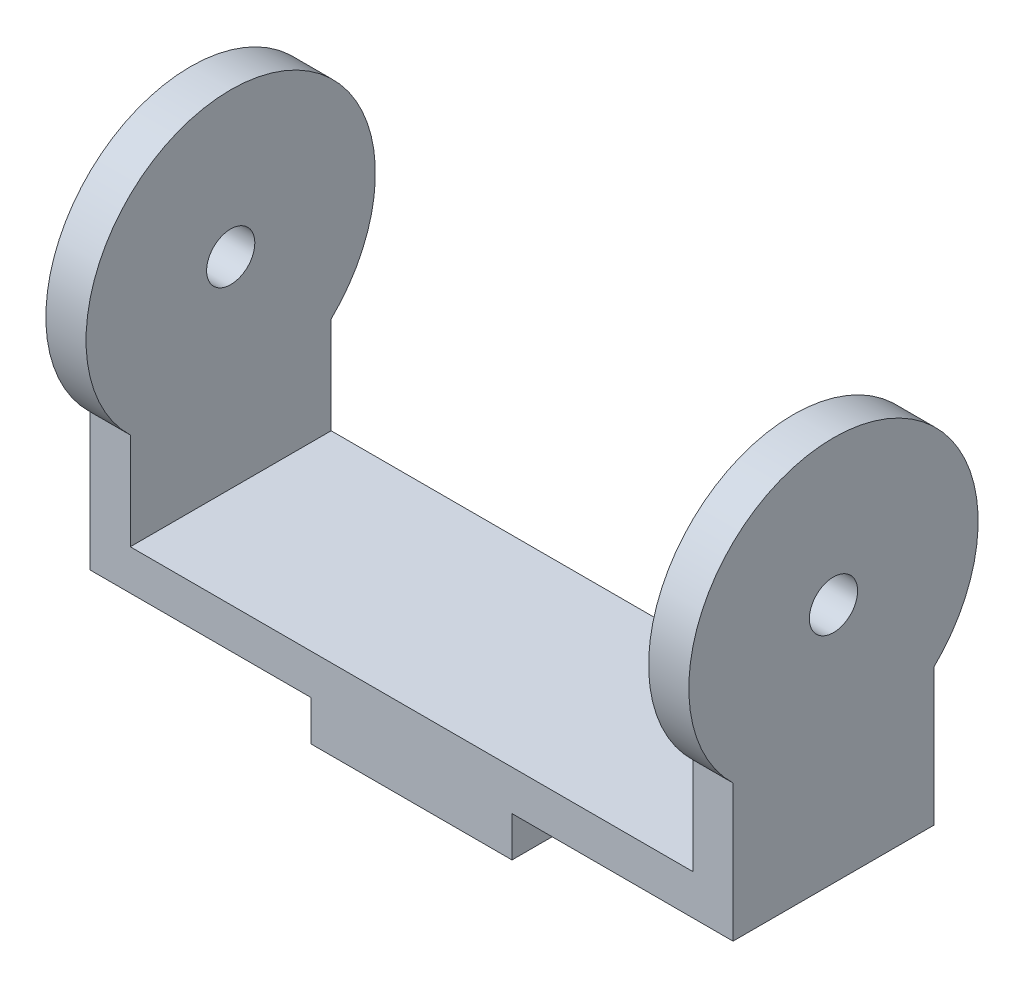
ISO-10303-21;
HEADER;
FILE_DESCRIPTION(('STEP AP214'),'2;1');
FILE_NAME('part.step','',(''),(''),'','','');
FILE_SCHEMA(('AUTOMOTIVE_DESIGN { 1 0 10303 214 1 1 1 1 }'));
ENDSEC;
DATA;
#1=APPLICATION_CONTEXT('core data for automotive mechanical design processes');
#2=APPLICATION_PROTOCOL_DEFINITION('international standard','automotive_design',2000,#1);
#3=PRODUCT_CONTEXT('',#1,'mechanical');
#4=PRODUCT('Part','Part','',(#3));
#5=PRODUCT_RELATED_PRODUCT_CATEGORY('part','',(#4));
#6=PRODUCT_DEFINITION_FORMATION('','',#4);
#7=PRODUCT_DEFINITION_CONTEXT('part definition',#1,'design');
#8=PRODUCT_DEFINITION('design','',#6,#7);
#9=PRODUCT_DEFINITION_SHAPE('','',#8);
#10=(LENGTH_UNIT() NAMED_UNIT(*) SI_UNIT(.MILLI.,.METRE.));
#11=(NAMED_UNIT(*) PLANE_ANGLE_UNIT() SI_UNIT($,.RADIAN.));
#12=(NAMED_UNIT(*) SI_UNIT($,.STERADIAN.) SOLID_ANGLE_UNIT());
#13=UNCERTAINTY_MEASURE_WITH_UNIT(LENGTH_MEASURE(1.E-05),#10,'distance_accuracy_value','');
#14=(GEOMETRIC_REPRESENTATION_CONTEXT(3) GLOBAL_UNCERTAINTY_ASSIGNED_CONTEXT((#13)) GLOBAL_UNIT_ASSIGNED_CONTEXT((#10,
#11,#12)) REPRESENTATION_CONTEXT('',''));
#15=CARTESIAN_POINT('',(0.,0.,0.));
#16=DIRECTION('',(0.,0.,1.));
#17=DIRECTION('',(1.,0.,0.));
#18=AXIS2_PLACEMENT_3D('',#15,#16,#17);
#19=CARTESIAN_POINT('',(0.,0.,0.));
#20=DIRECTION('',(0.,1.,0.));
#21=DIRECTION('',(0.,0.,1.));
#22=AXIS2_PLACEMENT_3D('',#19,#20,#21);
#23=PLANE('',#22);
#24=DIRECTION('',(0.,0.,1.));
#25=VECTOR('',#24,1.);
#26=CARTESIAN_POINT('',(12.5,0.,12.5));
#27=LINE('',#26,#25);
#28=CARTESIAN_POINT('',(12.5,0.,-12.5));
#29=VERTEX_POINT('',#28);
#30=CARTESIAN_POINT('',(12.5,0.,12.5));
#31=VERTEX_POINT('',#30);
#32=EDGE_CURVE('E52',#29,#31,#27,.T.);
#33=ORIENTED_EDGE('',*,*,#32,.F.);
#34=DIRECTION('',(-1.,0.,0.));
#35=VECTOR('',#34,1.);
#36=CARTESIAN_POINT('',(0.,0.,-12.5));
#37=LINE('',#36,#35);
#38=CARTESIAN_POINT('',(40.,0.,-12.5));
#39=VERTEX_POINT('',#38);
#40=EDGE_CURVE('E223',#39,#29,#37,.T.);
#41=ORIENTED_EDGE('',*,*,#40,.F.);
#42=DIRECTION('',(0.,0.,-1.));
#43=VECTOR('',#42,1.);
#44=CARTESIAN_POINT('',(40.,0.,-12.5));
#45=LINE('',#44,#43);
#46=CARTESIAN_POINT('',(40.,0.,12.5));
#47=VERTEX_POINT('',#46);
#48=EDGE_CURVE('E211',#47,#39,#45,.T.);
#49=ORIENTED_EDGE('',*,*,#48,.F.);
#50=DIRECTION('',(1.,0.,0.));
#51=VECTOR('',#50,1.);
#52=CARTESIAN_POINT('',(0.,0.,12.5));
#53=LINE('',#52,#51);
#54=EDGE_CURVE('E57',#31,#47,#53,.T.);
#55=ORIENTED_EDGE('',*,*,#54,.F.);
#56=EDGE_LOOP('',(#33,#41,#49,#55));
#57=FACE_BOUND('',#56,.T.);
#58=ADVANCED_FACE('F37',(#57),#23,.F.);
#59=DIRECTION('',(0.,0.,-1.));
#60=VECTOR('',#59,1.);
#61=CARTESIAN_POINT('',(-12.5,0.,12.5));
#62=LINE('',#61,#60);
#63=CARTESIAN_POINT('',(-12.5,0.,12.5));
#64=VERTEX_POINT('',#63);
#65=CARTESIAN_POINT('',(-12.5,0.,-12.5));
#66=VERTEX_POINT('',#65);
#67=EDGE_CURVE('E144',#64,#66,#62,.T.);
#68=ORIENTED_EDGE('',*,*,#67,.F.);
#69=CARTESIAN_POINT('',(-40.,0.,12.5));
#70=VERTEX_POINT('',#69);
#71=EDGE_CURVE('E218',#70,#64,#53,.T.);
#72=ORIENTED_EDGE('',*,*,#71,.F.);
#73=DIRECTION('',(0.,0.,-1.));
#74=VECTOR('',#73,1.);
#75=CARTESIAN_POINT('',(-40.,0.,-12.5));
#76=LINE('',#75,#74);
#77=CARTESIAN_POINT('',(-40.,0.,-12.5));
#78=VERTEX_POINT('',#77);
#79=EDGE_CURVE('E175',#70,#78,#76,.T.);
#80=ORIENTED_EDGE('',*,*,#79,.T.);
#81=EDGE_CURVE('E222',#66,#78,#37,.T.);
#82=ORIENTED_EDGE('',*,*,#81,.F.);
#83=EDGE_LOOP('',(#68,#72,#80,#82));
#84=FACE_BOUND('',#83,.T.);
#85=ADVANCED_FACE('F267',(#84),#23,.F.);
#86=CARTESIAN_POINT('',(0.,5.,0.));
#87=DIRECTION('',(0.,1.,0.));
#88=DIRECTION('',(0.,0.,1.));
#89=AXIS2_PLACEMENT_3D('',#86,#87,#88);
#90=PLANE('',#89);
#91=DIRECTION('',(-1.,0.,0.));
#92=VECTOR('',#91,1.);
#93=CARTESIAN_POINT('',(0.,5.,-12.5));
#94=LINE('',#93,#92);
#95=CARTESIAN_POINT('',(35.,5.,-12.5));
#96=VERTEX_POINT('',#95);
#97=CARTESIAN_POINT('',(-35.,5.,-12.5));
#98=VERTEX_POINT('',#97);
#99=EDGE_CURVE('E214',#96,#98,#94,.T.);
#100=ORIENTED_EDGE('',*,*,#99,.T.);
#101=DIRECTION('',(0.,0.,1.));
#102=VECTOR('',#101,1.);
#103=CARTESIAN_POINT('',(-35.,5.,0.));
#104=LINE('',#103,#102);
#105=CARTESIAN_POINT('',(-35.,5.,12.5));
#106=VERTEX_POINT('',#105);
#107=EDGE_CURVE('E164',#98,#106,#104,.T.);
#108=ORIENTED_EDGE('',*,*,#107,.T.);
#109=DIRECTION('',(1.,0.,0.));
#110=VECTOR('',#109,1.);
#111=CARTESIAN_POINT('',(0.,5.,12.5));
#112=LINE('',#111,#110);
#113=CARTESIAN_POINT('',(35.,5.,12.5));
#114=VERTEX_POINT('',#113);
#115=EDGE_CURVE('E217',#106,#114,#112,.T.);
#116=ORIENTED_EDGE('',*,*,#115,.T.);
#117=DIRECTION('',(0.,0.,1.));
#118=VECTOR('',#117,1.);
#119=CARTESIAN_POINT('',(35.,5.,0.));
#120=LINE('',#119,#118);
#121=EDGE_CURVE('E197',#96,#114,#120,.T.);
#122=ORIENTED_EDGE('',*,*,#121,.F.);
#123=EDGE_LOOP('',(#100,#108,#116,#122));
#124=FACE_BOUND('',#123,.T.);
#125=ADVANCED_FACE('F241',(#124),#90,.T.);
#126=CARTESIAN_POINT('',(40.,5.,-12.5));
#127=DIRECTION('',(-1.,0.,0.));
#128=DIRECTION('',(0.,0.,1.));
#129=AXIS2_PLACEMENT_3D('',#126,#127,#128);
#130=PLANE('',#129);
#131=ORIENTED_EDGE('',*,*,#48,.T.);
#132=DIRECTION('',(0.,-1.,0.));
#133=VECTOR('',#132,1.);
#134=CARTESIAN_POINT('',(40.,5.,-12.5));
#135=LINE('',#134,#133);
#136=CARTESIAN_POINT('',(40.,17.0481661530114,-12.5));
#137=VERTEX_POINT('',#136);
#138=EDGE_CURVE('E11',#137,#39,#135,.T.);
#139=ORIENTED_EDGE('',*,*,#138,.F.);
#140=CARTESIAN_POINT('',(40.,30.,0.));
#141=DIRECTION('',(1.,0.,0.));
#142=DIRECTION('',(0.,0.,-1.));
#143=AXIS2_PLACEMENT_3D('',#140,#141,#142);
#144=CIRCLE('',#143,18.);
#145=CARTESIAN_POINT('',(40.,17.0481661530114,12.5));
#146=VERTEX_POINT('',#145);
#147=EDGE_CURVE('E191',#137,#146,#144,.T.);
#148=ORIENTED_EDGE('',*,*,#147,.T.);
#149=DIRECTION('',(0.,-1.,0.));
#150=VECTOR('',#149,1.);
#151=CARTESIAN_POINT('',(40.,5.,12.5));
#152=LINE('',#151,#150);
#153=EDGE_CURVE('E45',#146,#47,#152,.T.);
#154=ORIENTED_EDGE('',*,*,#153,.T.);
#155=EDGE_LOOP('',(#131,#139,#148,#154));
#156=FACE_BOUND('',#155,.T.);
#157=CARTESIAN_POINT('',(40.,30.,0.));
#158=DIRECTION('',(1.,0.,0.));
#159=DIRECTION('',(0.,0.,-1.));
#160=AXIS2_PLACEMENT_3D('',#157,#158,#159);
#161=CIRCLE('',#160,3.);
#162=CARTESIAN_POINT('',(40.,30.,-3.));
#163=VERTEX_POINT('',#162);
#164=EDGE_CURVE('E186',#163,#163,#161,.T.);
#165=ORIENTED_EDGE('',*,*,#164,.F.);
#166=EDGE_LOOP('',(#165));
#167=FACE_BOUND('',#166,.T.);
#168=ADVANCED_FACE('F39',(#156,#167),#130,.F.);
#169=CARTESIAN_POINT('',(0.,5.,-12.5));
#170=DIRECTION('',(0.,0.,1.));
#171=DIRECTION('',(1.,0.,0.));
#172=AXIS2_PLACEMENT_3D('',#169,#170,#171);
#173=PLANE('',#172);
#174=ORIENTED_EDGE('',*,*,#40,.T.);
#175=DIRECTION('',(0.,1.,0.));
#176=VECTOR('',#175,1.);
#177=CARTESIAN_POINT('',(12.5,-5.,-12.5));
#178=LINE('',#177,#176);
#179=CARTESIAN_POINT('',(12.5,-5.,-12.5));
#180=VERTEX_POINT('',#179);
#181=EDGE_CURVE('E262',#180,#29,#178,.T.);
#182=ORIENTED_EDGE('',*,*,#181,.F.);
#183=DIRECTION('',(1.,0.,0.));
#184=VECTOR('',#183,1.);
#185=CARTESIAN_POINT('',(-12.5,-5.,-12.5));
#186=LINE('',#185,#184);
#187=CARTESIAN_POINT('',(-12.5,-5.,-12.5));
#188=VERTEX_POINT('',#187);
#189=EDGE_CURVE('E140',#188,#180,#186,.T.);
#190=ORIENTED_EDGE('',*,*,#189,.F.);
#191=DIRECTION('',(0.,1.,0.));
#192=VECTOR('',#191,1.);
#193=CARTESIAN_POINT('',(-12.5,-5.,-12.5));
#194=LINE('',#193,#192);
#195=EDGE_CURVE('E152',#188,#66,#194,.T.);
#196=ORIENTED_EDGE('',*,*,#195,.T.);
#197=ORIENTED_EDGE('',*,*,#81,.T.);
#198=DIRECTION('',(0.,-1.,0.));
#199=VECTOR('',#198,1.);
#200=CARTESIAN_POINT('',(-40.,5.,-12.5));
#201=LINE('',#200,#199);
#202=CARTESIAN_POINT('',(-40.,17.0481661530114,-12.5));
#203=VERTEX_POINT('',#202);
#204=EDGE_CURVE('E180',#203,#78,#201,.T.);
#205=ORIENTED_EDGE('',*,*,#204,.F.);
#206=DIRECTION('',(-1.,0.,0.));
#207=VECTOR('',#206,1.);
#208=CARTESIAN_POINT('',(-35.,17.0481661530114,-12.5));
#209=LINE('',#208,#207);
#210=CARTESIAN_POINT('',(-35.,17.0481661530114,-12.5));
#211=VERTEX_POINT('',#210);
#212=EDGE_CURVE('E168',#211,#203,#209,.T.);
#213=ORIENTED_EDGE('',*,*,#212,.F.);
#214=DIRECTION('',(0.,1.,0.));
#215=VECTOR('',#214,1.);
#216=CARTESIAN_POINT('',(-35.,0.,-12.5));
#217=LINE('',#216,#215);
#218=EDGE_CURVE('E162',#98,#211,#217,.T.);
#219=ORIENTED_EDGE('',*,*,#218,.F.);
#220=ORIENTED_EDGE('',*,*,#99,.F.);
#221=DIRECTION('',(0.,1.,0.));
#222=VECTOR('',#221,1.);
#223=CARTESIAN_POINT('',(35.,0.,-12.5));
#224=LINE('',#223,#222);
#225=CARTESIAN_POINT('',(35.,17.0481661530114,-12.5));
#226=VERTEX_POINT('',#225);
#227=EDGE_CURVE('E200',#96,#226,#224,.T.);
#228=ORIENTED_EDGE('',*,*,#227,.T.);
#229=DIRECTION('',(1.,0.,0.));
#230=VECTOR('',#229,1.);
#231=CARTESIAN_POINT('',(35.,17.0481661530114,-12.5));
#232=LINE('',#231,#230);
#233=EDGE_CURVE('E208',#226,#137,#232,.T.);
#234=ORIENTED_EDGE('',*,*,#233,.T.);
#235=ORIENTED_EDGE('',*,*,#138,.T.);
#236=EDGE_LOOP('',(#174,#182,#190,#196,#197,#205,#213,#219,#220,#228,#234,#235));
#237=FACE_BOUND('',#236,.T.);
#238=ADVANCED_FACE('F230',(#237),#173,.F.);
#239=CARTESIAN_POINT('',(0.,5.,12.5));
#240=DIRECTION('',(0.,0.,-1.));
#241=DIRECTION('',(-1.,0.,0.));
#242=AXIS2_PLACEMENT_3D('',#239,#240,#241);
#243=PLANE('',#242);
#244=ORIENTED_EDGE('',*,*,#71,.T.);
#245=DIRECTION('',(0.,1.,0.));
#246=VECTOR('',#245,1.);
#247=CARTESIAN_POINT('',(-12.5,-5.,12.5));
#248=LINE('',#247,#246);
#249=CARTESIAN_POINT('',(-12.5,-5.,12.5));
#250=VERTEX_POINT('',#249);
#251=EDGE_CURVE('E131',#250,#64,#248,.T.);
#252=ORIENTED_EDGE('',*,*,#251,.F.);
#253=DIRECTION('',(-1.,0.,0.));
#254=VECTOR('',#253,1.);
#255=CARTESIAN_POINT('',(-12.5,-5.,12.5));
#256=LINE('',#255,#254);
#257=CARTESIAN_POINT('',(12.5,-5.,12.5));
#258=VERTEX_POINT('',#257);
#259=EDGE_CURVE('E124',#258,#250,#256,.T.);
#260=ORIENTED_EDGE('',*,*,#259,.F.);
#261=DIRECTION('',(0.,1.,0.));
#262=VECTOR('',#261,1.);
#263=CARTESIAN_POINT('',(12.5,-5.,12.5));
#264=LINE('',#263,#262);
#265=EDGE_CURVE('E129',#258,#31,#264,.T.);
#266=ORIENTED_EDGE('',*,*,#265,.T.);
#267=ORIENTED_EDGE('',*,*,#54,.T.);
#268=ORIENTED_EDGE('',*,*,#153,.F.);
#269=DIRECTION('',(1.,0.,0.));
#270=VECTOR('',#269,1.);
#271=CARTESIAN_POINT('',(35.,17.0481661530114,12.5));
#272=LINE('',#271,#270);
#273=CARTESIAN_POINT('',(35.,17.0481661530114,12.5));
#274=VERTEX_POINT('',#273);
#275=EDGE_CURVE('E203',#274,#146,#272,.T.);
#276=ORIENTED_EDGE('',*,*,#275,.F.);
#277=DIRECTION('',(0.,-1.,0.));
#278=VECTOR('',#277,1.);
#279=CARTESIAN_POINT('',(35.,0.,12.5));
#280=LINE('',#279,#278);
#281=EDGE_CURVE('E194',#274,#114,#280,.T.);
#282=ORIENTED_EDGE('',*,*,#281,.T.);
#283=ORIENTED_EDGE('',*,*,#115,.F.);
#284=DIRECTION('',(0.,-1.,0.));
#285=VECTOR('',#284,1.);
#286=CARTESIAN_POINT('',(-35.,0.,12.5));
#287=LINE('',#286,#285);
#288=CARTESIAN_POINT('',(-35.,17.0481661530114,12.5));
#289=VERTEX_POINT('',#288);
#290=EDGE_CURVE('E167',#289,#106,#287,.T.);
#291=ORIENTED_EDGE('',*,*,#290,.F.);
#292=DIRECTION('',(-1.,0.,0.));
#293=VECTOR('',#292,1.);
#294=CARTESIAN_POINT('',(-35.,17.0481661530114,12.5));
#295=LINE('',#294,#293);
#296=CARTESIAN_POINT('',(-40.,17.0481661530114,12.5));
#297=VERTEX_POINT('',#296);
#298=EDGE_CURVE('E172',#289,#297,#295,.T.);
#299=ORIENTED_EDGE('',*,*,#298,.T.);
#300=DIRECTION('',(0.,-1.,0.));
#301=VECTOR('',#300,1.);
#302=CARTESIAN_POINT('',(-40.,5.,12.5));
#303=LINE('',#302,#301);
#304=EDGE_CURVE('E183',#297,#70,#303,.T.);
#305=ORIENTED_EDGE('',*,*,#304,.T.);
#306=EDGE_LOOP('',(#244,#252,#260,#266,#267,#268,#276,#282,#283,#291,#299,#305));
#307=FACE_BOUND('',#306,.T.);
#308=ADVANCED_FACE('F127',(#307),#243,.F.);
#309=CARTESIAN_POINT('',(35.,30.,0.));
#310=DIRECTION('',(1.,0.,0.));
#311=DIRECTION('',(0.,0.,-1.));
#312=AXIS2_PLACEMENT_3D('',#309,#310,#311);
#313=CYLINDRICAL_SURFACE('',#312,18.);
#314=ORIENTED_EDGE('',*,*,#147,.F.);
#315=ORIENTED_EDGE('',*,*,#233,.F.);
#316=CARTESIAN_POINT('',(35.,30.,0.));
#317=DIRECTION('',(1.,0.,0.));
#318=DIRECTION('',(0.,0.,-1.));
#319=AXIS2_PLACEMENT_3D('',#316,#317,#318);
#320=CIRCLE('',#319,18.);
#321=EDGE_CURVE('E190',#226,#274,#320,.T.);
#322=ORIENTED_EDGE('',*,*,#321,.T.);
#323=ORIENTED_EDGE('',*,*,#275,.T.);
#324=EDGE_LOOP('',(#314,#315,#322,#323));
#325=FACE_BOUND('',#324,.T.);
#326=ADVANCED_FACE('F235',(#325),#313,.T.);
#327=CARTESIAN_POINT('',(35.,30.,0.));
#328=DIRECTION('',(1.,0.,0.));
#329=DIRECTION('',(0.,0.,-1.));
#330=AXIS2_PLACEMENT_3D('',#327,#328,#329);
#331=CYLINDRICAL_SURFACE('',#330,3.);
#332=CARTESIAN_POINT('',(35.,30.,0.));
#333=DIRECTION('',(1.,0.,0.));
#334=DIRECTION('',(0.,0.,-1.));
#335=AXIS2_PLACEMENT_3D('',#332,#333,#334);
#336=CIRCLE('',#335,3.);
#337=CARTESIAN_POINT('',(35.,30.,-3.));
#338=VERTEX_POINT('',#337);
#339=EDGE_CURVE('E187',#338,#338,#336,.T.);
#340=ORIENTED_EDGE('',*,*,#339,.F.);
#341=EDGE_LOOP('',(#340));
#342=FACE_BOUND('',#341,.T.);
#343=ORIENTED_EDGE('',*,*,#164,.T.);
#344=EDGE_LOOP('',(#343));
#345=FACE_BOUND('',#344,.T.);
#346=ADVANCED_FACE('F388',(#342,#345),#331,.F.);
#347=CARTESIAN_POINT('',(35.,0.,0.));
#348=DIRECTION('',(1.,0.,0.));
#349=DIRECTION('',(0.,0.,-1.));
#350=AXIS2_PLACEMENT_3D('',#347,#348,#349);
#351=PLANE('',#350);
#352=ORIENTED_EDGE('',*,*,#339,.T.);
#353=EDGE_LOOP('',(#352));
#354=FACE_BOUND('',#353,.T.);
#355=ORIENTED_EDGE('',*,*,#321,.F.);
#356=ORIENTED_EDGE('',*,*,#227,.F.);
#357=ORIENTED_EDGE('',*,*,#121,.T.);
#358=ORIENTED_EDGE('',*,*,#281,.F.);
#359=EDGE_LOOP('',(#355,#356,#357,#358));
#360=FACE_BOUND('',#359,.T.);
#361=ADVANCED_FACE('F239',(#354,#360),#351,.F.);
#362=CARTESIAN_POINT('',(-40.,5.,-12.5));
#363=DIRECTION('',(-1.,0.,0.));
#364=DIRECTION('',(0.,0.,1.));
#365=AXIS2_PLACEMENT_3D('',#362,#363,#364);
#366=PLANE('',#365);
#367=ORIENTED_EDGE('',*,*,#79,.F.);
#368=ORIENTED_EDGE('',*,*,#304,.F.);
#369=CARTESIAN_POINT('',(-40.,30.,0.));
#370=DIRECTION('',(1.,0.,0.));
#371=DIRECTION('',(0.,0.,-1.));
#372=AXIS2_PLACEMENT_3D('',#369,#370,#371);
#373=CIRCLE('',#372,18.);
#374=EDGE_CURVE('E150',#203,#297,#373,.T.);
#375=ORIENTED_EDGE('',*,*,#374,.F.);
#376=ORIENTED_EDGE('',*,*,#204,.T.);
#377=EDGE_LOOP('',(#367,#368,#375,#376));
#378=FACE_BOUND('',#377,.T.);
#379=CARTESIAN_POINT('',(-40.,30.,0.));
#380=DIRECTION('',(1.,0.,0.));
#381=DIRECTION('',(0.,0.,-1.));
#382=AXIS2_PLACEMENT_3D('',#379,#380,#381);
#383=CIRCLE('',#382,3.);
#384=CARTESIAN_POINT('',(-40.,30.,-2.99999999999999));
#385=VERTEX_POINT('',#384);
#386=EDGE_CURVE('E147',#385,#385,#383,.T.);
#387=ORIENTED_EDGE('',*,*,#386,.T.);
#388=EDGE_LOOP('',(#387));
#389=FACE_BOUND('',#388,.T.);
#390=ADVANCED_FACE('F253',(#378,#389),#366,.T.);
#391=CARTESIAN_POINT('',(-35.,30.,0.));
#392=DIRECTION('',(-1.,0.,0.));
#393=DIRECTION('',(0.,0.,1.));
#394=AXIS2_PLACEMENT_3D('',#391,#392,#393);
#395=CYLINDRICAL_SURFACE('',#394,18.);
#396=ORIENTED_EDGE('',*,*,#374,.T.);
#397=ORIENTED_EDGE('',*,*,#298,.F.);
#398=CARTESIAN_POINT('',(-35.,30.,0.));
#399=DIRECTION('',(1.,0.,0.));
#400=DIRECTION('',(0.,0.,-1.));
#401=AXIS2_PLACEMENT_3D('',#398,#399,#400);
#402=CIRCLE('',#401,18.);
#403=EDGE_CURVE('E159',#211,#289,#402,.T.);
#404=ORIENTED_EDGE('',*,*,#403,.F.);
#405=ORIENTED_EDGE('',*,*,#212,.T.);
#406=EDGE_LOOP('',(#396,#397,#404,#405));
#407=FACE_BOUND('',#406,.T.);
#408=ADVANCED_FACE('F249',(#407),#395,.T.);
#409=CARTESIAN_POINT('',(-35.,30.,0.));
#410=DIRECTION('',(-1.,0.,0.));
#411=DIRECTION('',(0.,0.,1.));
#412=AXIS2_PLACEMENT_3D('',#409,#410,#411);
#413=CYLINDRICAL_SURFACE('',#412,3.);
#414=CARTESIAN_POINT('',(-35.,30.,0.));
#415=DIRECTION('',(1.,0.,0.));
#416=DIRECTION('',(0.,0.,-1.));
#417=AXIS2_PLACEMENT_3D('',#414,#415,#416);
#418=CIRCLE('',#417,3.);
#419=CARTESIAN_POINT('',(-35.,30.,-2.99999999999999));
#420=VERTEX_POINT('',#419);
#421=EDGE_CURVE('E156',#420,#420,#418,.T.);
#422=ORIENTED_EDGE('',*,*,#421,.T.);
#423=EDGE_LOOP('',(#422));
#424=FACE_BOUND('',#423,.T.);
#425=ORIENTED_EDGE('',*,*,#386,.F.);
#426=EDGE_LOOP('',(#425));
#427=FACE_BOUND('',#426,.T.);
#428=ADVANCED_FACE('F315',(#424,#427),#413,.F.);
#429=CARTESIAN_POINT('',(-35.,0.,0.));
#430=DIRECTION('',(-1.,0.,0.));
#431=DIRECTION('',(0.,0.,-1.));
#432=AXIS2_PLACEMENT_3D('',#429,#430,#431);
#433=PLANE('',#432);
#434=ORIENTED_EDGE('',*,*,#421,.F.);
#435=EDGE_LOOP('',(#434));
#436=FACE_BOUND('',#435,.T.);
#437=ORIENTED_EDGE('',*,*,#403,.T.);
#438=ORIENTED_EDGE('',*,*,#290,.T.);
#439=ORIENTED_EDGE('',*,*,#107,.F.);
#440=ORIENTED_EDGE('',*,*,#218,.T.);
#441=EDGE_LOOP('',(#437,#438,#439,#440));
#442=FACE_BOUND('',#441,.T.);
#443=ADVANCED_FACE('F246',(#436,#442),#433,.F.);
#444=CARTESIAN_POINT('',(12.5,-5.,12.5));
#445=DIRECTION('',(-1.,0.,0.));
#446=DIRECTION('',(0.,0.,1.));
#447=AXIS2_PLACEMENT_3D('',#444,#445,#446);
#448=PLANE('',#447);
#449=ORIENTED_EDGE('',*,*,#32,.T.);
#450=ORIENTED_EDGE('',*,*,#265,.F.);
#451=DIRECTION('',(0.,0.,1.));
#452=VECTOR('',#451,1.);
#453=CARTESIAN_POINT('',(12.5,-5.,12.5));
#454=LINE('',#453,#452);
#455=EDGE_CURVE('E135',#180,#258,#454,.T.);
#456=ORIENTED_EDGE('',*,*,#455,.F.);
#457=ORIENTED_EDGE('',*,*,#181,.T.);
#458=EDGE_LOOP('',(#449,#450,#456,#457));
#459=FACE_BOUND('',#458,.T.);
#460=ADVANCED_FACE('F146',(#459),#448,.F.);
#461=CARTESIAN_POINT('',(-12.5,-5.,12.5));
#462=DIRECTION('',(1.,0.,0.));
#463=DIRECTION('',(0.,0.,-1.));
#464=AXIS2_PLACEMENT_3D('',#461,#462,#463);
#465=PLANE('',#464);
#466=ORIENTED_EDGE('',*,*,#67,.T.);
#467=ORIENTED_EDGE('',*,*,#195,.F.);
#468=DIRECTION('',(0.,0.,-1.));
#469=VECTOR('',#468,1.);
#470=CARTESIAN_POINT('',(-12.5,-5.,12.5));
#471=LINE('',#470,#469);
#472=EDGE_CURVE('E134',#250,#188,#471,.T.);
#473=ORIENTED_EDGE('',*,*,#472,.F.);
#474=ORIENTED_EDGE('',*,*,#251,.T.);
#475=EDGE_LOOP('',(#466,#467,#473,#474));
#476=FACE_BOUND('',#475,.T.);
#477=ADVANCED_FACE('F258',(#476),#465,.F.);
#478=CARTESIAN_POINT('',(0.,-5.,0.));
#479=DIRECTION('',(0.,-1.,0.));
#480=DIRECTION('',(0.,0.,-1.));
#481=AXIS2_PLACEMENT_3D('',#478,#479,#480);
#482=PLANE('',#481);
#483=ORIENTED_EDGE('',*,*,#455,.T.);
#484=ORIENTED_EDGE('',*,*,#259,.T.);
#485=ORIENTED_EDGE('',*,*,#472,.T.);
#486=ORIENTED_EDGE('',*,*,#189,.T.);
#487=EDGE_LOOP('',(#483,#484,#485,#486));
#488=FACE_BOUND('',#487,.T.);
#489=ADVANCED_FACE('F138',(#488),#482,.T.);
#490=CLOSED_SHELL('',(#58,#85,#125,#168,#238,#308,#326,#346,#361,#390,#408,#428,#443,#460,#477,#489));
#491=MANIFOLD_SOLID_BREP('B2',#490);
#492=ADVANCED_BREP_SHAPE_REPRESENTATION('',(#18,#491),#14);
#493=SHAPE_DEFINITION_REPRESENTATION(#9,#492);
ENDSEC;
END-ISO-10303-21;
